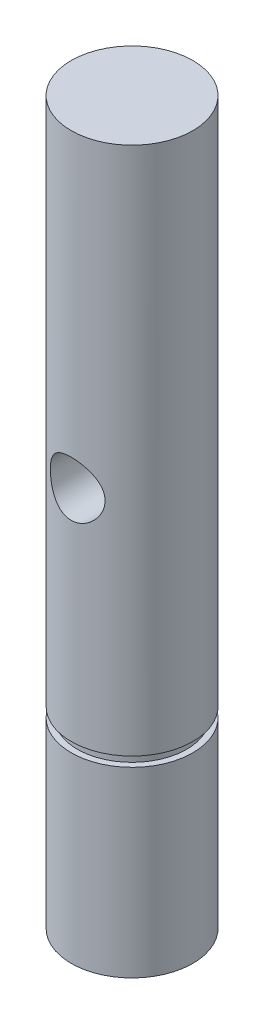
ISO-10303-21;
HEADER;
FILE_DESCRIPTION(('STEP AP214'),'2;1');
FILE_NAME('part.step','',(''),(''),'','','');
FILE_SCHEMA(('AUTOMOTIVE_DESIGN { 1 0 10303 214 1 1 1 1 }'));
ENDSEC;
DATA;
#1=APPLICATION_CONTEXT('core data for automotive mechanical design processes');
#2=APPLICATION_PROTOCOL_DEFINITION('international standard','automotive_design',2000,#1);
#3=PRODUCT_CONTEXT('',#1,'mechanical');
#4=PRODUCT('Part','Part','',(#3));
#5=PRODUCT_RELATED_PRODUCT_CATEGORY('part','',(#4));
#6=PRODUCT_DEFINITION_FORMATION('','',#4);
#7=PRODUCT_DEFINITION_CONTEXT('part definition',#1,'design');
#8=PRODUCT_DEFINITION('design','',#6,#7);
#9=PRODUCT_DEFINITION_SHAPE('','',#8);
#10=(LENGTH_UNIT() NAMED_UNIT(*) SI_UNIT(.MILLI.,.METRE.));
#11=(NAMED_UNIT(*) PLANE_ANGLE_UNIT() SI_UNIT($,.RADIAN.));
#12=(NAMED_UNIT(*) SI_UNIT($,.STERADIAN.) SOLID_ANGLE_UNIT());
#13=UNCERTAINTY_MEASURE_WITH_UNIT(LENGTH_MEASURE(1.E-05),#10,'distance_accuracy_value','');
#14=(GEOMETRIC_REPRESENTATION_CONTEXT(3) GLOBAL_UNCERTAINTY_ASSIGNED_CONTEXT((#13)) GLOBAL_UNIT_ASSIGNED_CONTEXT((#10,
#11,#12)) REPRESENTATION_CONTEXT('',''));
#15=CARTESIAN_POINT('',(0.,0.,0.));
#16=DIRECTION('',(0.,0.,1.));
#17=DIRECTION('',(1.,0.,0.));
#18=AXIS2_PLACEMENT_3D('',#15,#16,#17);
#19=CARTESIAN_POINT('',(0.,59.3,0.));
#20=DIRECTION('',(0.,-1.,0.));
#21=DIRECTION('',(0.,0.,-1.));
#22=AXIS2_PLACEMENT_3D('',#19,#20,#21);
#23=CYLINDRICAL_SURFACE('',#22,5.);
#24=CARTESIAN_POINT('',(0.,36.05,-5.));
#25=CARTESIAN_POINT('',(-0.119657163872057,36.0499941508325,-4.9999951803291));
#26=CARTESIAN_POINT('',(-0.2394972095774,36.040398554356,-4.99565681806759));
#27=CARTESIAN_POINT('',(-0.475720816707709,36.0024004970845,-4.97873356251569));
#28=CARTESIAN_POINT('',(-0.592095550925139,35.9739536941356,-4.96612922657762));
#29=CARTESIAN_POINT('',(-0.817598389702703,35.8995417374731,-4.93401032574636));
#30=CARTESIAN_POINT('',(-0.926750955125893,35.8536396901104,-4.91452067131296));
#31=CARTESIAN_POINT('',(-1.13568251878513,35.745906304151,-4.87048664392257));
#32=CARTESIAN_POINT('',(-1.23546350613327,35.6840783562912,-4.84594334714473));
#33=CARTESIAN_POINT('',(-1.42864166958965,35.5425702502373,-4.7926545488551));
#34=CARTESIAN_POINT('',(-1.52144083505235,35.4621315255467,-4.76375726911886));
#35=CARTESIAN_POINT('',(-1.69276142751265,35.2872976020405,-4.7056093324505));
#36=CARTESIAN_POINT('',(-1.77127412914542,35.1928939376057,-4.67635847112187));
#37=CARTESIAN_POINT('',(-1.91644184676257,34.9860212054054,-4.61884309478044));
#38=CARTESIAN_POINT('',(-1.98211224629651,34.8728110950827,-4.59074106078138));
#39=CARTESIAN_POINT('',(-2.09321326547296,34.6355185417193,-4.54116574662787));
#40=CARTESIAN_POINT('',(-2.13865597929339,34.5114426486112,-4.51968850785886));
#41=CARTESIAN_POINT('',(-2.2054422070107,34.262806781862,-4.48746493874362));
#42=CARTESIAN_POINT('',(-2.22794402601262,34.1386271752549,-4.47620638732559));
#43=CARTESIAN_POINT('',(-2.25180742161622,33.8877845994371,-4.46425372050826));
#44=CARTESIAN_POINT('',(-2.25318367120293,33.7611234150613,-4.46355227256902));
#45=CARTESIAN_POINT('',(-2.23561914182213,33.5214180581905,-4.4723671338535));
#46=CARTESIAN_POINT('',(-2.2185407575292,33.4081955432716,-4.48094689435861));
#47=CARTESIAN_POINT('',(-2.16771485945775,33.1864380235561,-4.5057522601785));
#48=CARTESIAN_POINT('',(-2.13396347414753,33.0779041138392,-4.52197964125845));
#49=CARTESIAN_POINT('',(-2.05008139659869,32.8656613346161,-4.56062840437285));
#50=CARTESIAN_POINT('',(-1.99959732959401,32.7621172350035,-4.58318164475399));
#51=CARTESIAN_POINT('',(-1.88393825005056,32.5645259052392,-4.63192287969266));
#52=CARTESIAN_POINT('',(-1.81875698614686,32.4704827409736,-4.65811241910162));
#53=CARTESIAN_POINT('',(-1.66791131474516,32.2846493257256,-4.71435794303027));
#54=CARTESIAN_POINT('',(-1.58084940988695,32.194027618604,-4.74453849261979));
#55=CARTESIAN_POINT('',(-1.39252160551636,32.0282416628495,-4.80318714257221));
#56=CARTESIAN_POINT('',(-1.2912512139917,31.9530823212481,-4.83165469728905));
#57=CARTESIAN_POINT('',(-1.07332333935315,31.8182362246468,-4.88476427737967));
#58=CARTESIAN_POINT('',(-0.956286364396326,31.7591009344205,-4.90926046885464));
#59=CARTESIAN_POINT('',(-0.712539817711667,31.6617820285451,-4.95050723789684));
#60=CARTESIAN_POINT('',(-0.585836558945032,31.6235848695963,-4.96726282117482));
#61=CARTESIAN_POINT('',(-0.336050927795551,31.5718479933816,-4.99015693100556));
#62=CARTESIAN_POINT('',(-0.213354125401072,31.5567448896773,-4.99696705652231));
#63=CARTESIAN_POINT('',(0.033002854959611,31.5468706262329,-5.00140648285731));
#64=CARTESIAN_POINT('',(0.156662679358164,31.5520923259077,-4.99903900798532));
#65=CARTESIAN_POINT('',(0.393606397102686,31.5816725282754,-4.98581223187087));
#66=CARTESIAN_POINT('',(0.507068143127033,31.6048661216162,-4.97547003197285));
#67=CARTESIAN_POINT('',(0.728326171242952,31.6680331296803,-4.94792660884623));
#68=CARTESIAN_POINT('',(0.836121769198286,31.708008565447,-4.93072455949595));
#69=CARTESIAN_POINT('',(1.0468032844483,31.8048645461602,-4.89040595603713));
#70=CARTESIAN_POINT('',(1.14943204917315,31.8622324242414,-4.86712201520423));
#71=CARTESIAN_POINT('',(1.34397554623912,31.9917138422134,-4.81703610915173));
#72=CARTESIAN_POINT('',(1.43588556437493,32.0638338321065,-4.79023260693119));
#73=CARTESIAN_POINT('',(1.61437331335905,32.227690333341,-4.73321088066406));
#74=CARTESIAN_POINT('',(1.69988735602747,32.3205536670442,-4.70289328565378));
#75=CARTESIAN_POINT('',(1.85448776672914,32.5196605639013,-4.64410716992065));
#76=CARTESIAN_POINT('',(1.92356783385003,32.6259092352926,-4.61563936145101));
#77=CARTESIAN_POINT('',(2.0448687723509,32.8524119938838,-4.56322301354684));
#78=CARTESIAN_POINT('',(2.09661295115779,32.9729549150335,-4.53940877273745));
#79=CARTESIAN_POINT('',(2.17856642952346,33.2224663797286,-4.50065987671192));
#80=CARTESIAN_POINT('',(2.20879749107799,33.3514262643155,-4.48571625080529));
#81=CARTESIAN_POINT('',(2.24454528993164,33.602147412113,-4.46792778615278));
#82=CARTESIAN_POINT('',(2.25196758692373,33.7235711103763,-4.46415115998432));
#83=CARTESIAN_POINT('',(2.24714266058781,33.9659106486577,-4.46658268326981));
#84=CARTESIAN_POINT('',(2.23489992569103,34.0868265982512,-4.47278855427626));
#85=CARTESIAN_POINT('',(2.19277345398221,34.3167678221568,-4.49357716344733));
#86=CARTESIAN_POINT('',(2.1640532846186,34.4260616630034,-4.50760581250428));
#87=CARTESIAN_POINT('',(2.09103437001124,34.6382569690474,-4.54193721731516));
#88=CARTESIAN_POINT('',(2.04673109152544,34.7411565638507,-4.56224179857571));
#89=CARTESIAN_POINT('',(1.94052895513635,34.9449425819386,-4.60845986490249));
#90=CARTESIAN_POINT('',(1.87767694712305,35.045267781668,-4.63465129287797));
#91=CARTESIAN_POINT('',(1.7373806274927,35.2345379466943,-4.68904747578369));
#92=CARTESIAN_POINT('',(1.65993003008871,35.3234779820221,-4.71725309471255));
#93=CARTESIAN_POINT('',(1.48434630972137,35.4957826227624,-4.77556462695219));
#94=CARTESIAN_POINT('',(1.3849750965528,35.5779120561799,-4.8056111870999));
#95=CARTESIAN_POINT('',(1.17282336441816,35.7244746098651,-4.8617393821882));
#96=CARTESIAN_POINT('',(1.06003671208436,35.7888995909801,-4.88781919106815));
#97=CARTESIAN_POINT('',(0.825071548433898,35.8972194043047,-4.93289199970098));
#98=CARTESIAN_POINT('',(0.702997935707187,35.9413126019502,-4.95195309116145));
#99=CARTESIAN_POINT('',(0.452281842298332,36.0078630803421,-4.9810892043169));
#100=CARTESIAN_POINT('',(0.323660544978677,36.0303859776352,-4.9911914716417));
#101=CARTESIAN_POINT('',(0.161835421205047,36.044407857878,-4.99748612119021));
#102=CARTESIAN_POINT('',(0.129515019999642,36.0465028809597,-4.99842714593435));
#103=CARTESIAN_POINT('',(0.0648008846979576,36.0492997536287,-4.99968474227602));
#104=CARTESIAN_POINT('',(0.0324071496041521,36.0500015841496,-5.00000130532758));
#105=CARTESIAN_POINT('',(0.,36.05,-5.));
#106=B_SPLINE_CURVE_WITH_KNOTS('',3,(#24,#25,#26,#27,#28,#29,#30,#31,#32,#33,#34,#35,#36,#37,
#38,#39,#40,#41,#42,#43,#44,#45,#46,#47,#48,#49,#50,#51,#52,#53,#54,#55,#56,#57,#58,#59,#60,#61,
#62,#63,#64,#65,#66,#67,#68,#69,#70,#71,#72,#73,#74,#75,#76,#77,#78,#79,#80,#81,#82,#83,#84,#85,
#86,#87,#88,#89,#90,#91,#92,#93,#94,#95,#96,#97,#98,#99,#100,#101,#102,#103,#104,#105),
.UNSPECIFIED.,.T.,.F.,(4,2,2,2,2,2,2,2,2,2,2,2,2,2,2,2,2,2,2,2,2,2,2,2,2,2,2,2,2,2,2,2,2,2,2,2,
2,2,2,2,4),(0.,0.358838474045362,0.718524024886281,1.07692137234716,1.43524247745089,
1.81211589040082,2.18921870938886,2.58877923399089,2.98810053852175,3.36607753259061,
3.74379198689987,4.08666490416552,4.42961747522457,4.78033096378956,5.13119390858612,
5.51719011281458,5.90330862586184,6.30138888099423,6.69921134324785,7.06867955514896,
7.43801797582675,7.78523528011159,8.13249441190392,8.49055929702834,8.84878107324681,
9.23652488450211,9.62441712097651,10.0222360675986,10.4196520187761,10.782814484147,
11.1458940715369,11.486031651511,11.8262682619787,12.1885231613985,12.5509343964944,
12.9461798591982,13.3416067227122,13.7330894595624,14.1233774929091,14.2205615861382,
14.3177470093574),.UNSPECIFIED.);
#107=CARTESIAN_POINT('',(0.,36.05,-5.));
#108=VERTEX_POINT('',#107);
#109=EDGE_CURVE('E10',#108,#108,#106,.T.);
#110=ORIENTED_EDGE('',*,*,#109,.T.);
#111=EDGE_LOOP('',(#110));
#112=FACE_BOUND('',#111,.T.);
#113=CARTESIAN_POINT('',(2.25,33.8,4.46514277487294));
#114=CARTESIAN_POINT('',(2.24999304031583,33.6810387872691,4.46515039872742));
#115=CARTESIAN_POINT('',(2.24050444334663,33.5618852197389,4.4699666726898));
#116=CARTESIAN_POINT('',(2.20296952025721,33.3271018284973,4.48857891323592));
#117=CARTESIAN_POINT('',(2.17487687588999,33.2114815551227,4.50239729083484));
#118=CARTESIAN_POINT('',(2.10149811494296,32.9875840285442,4.53710585458752));
#119=CARTESIAN_POINT('',(2.05629003690716,32.879276037285,4.55796389692775));
#120=CARTESIAN_POINT('',(1.95019826041788,32.671809245018,4.6043530345761));
#121=CARTESIAN_POINT('',(1.88931647308661,32.5726493305704,4.62988356005072));
#122=CARTESIAN_POINT('',(1.74886682448111,32.3790152310073,4.6848168738739));
#123=CARTESIAN_POINT('',(1.66832919766814,32.2852850632113,4.71436409953233));
#124=CARTESIAN_POINT('',(1.49288314705885,32.1121009236461,4.77282391954203));
#125=CARTESIAN_POINT('',(1.39796864967689,32.0326530166617,4.80173623973545));
#126=CARTESIAN_POINT('',(1.19040340238111,31.8862642005538,4.85747480215182));
#127=CARTESIAN_POINT('',(1.0770863493284,31.8201902456851,4.88411395697375));
#128=CARTESIAN_POINT('',(0.839526009772626,31.7083730190249,4.93049745168418));
#129=CARTESIAN_POINT('',(0.715288381409386,31.6626192924835,4.95024533600557));
#130=CARTESIAN_POINT('',(0.46725363211648,31.5955312718054,4.97959116820759));
#131=CARTESIAN_POINT('',(0.343870281116729,31.5729058054981,4.98972320525301));
#132=CARTESIAN_POINT('',(0.0946715176300397,31.5485139386555,5.00065622282591));
#133=CARTESIAN_POINT('',(-0.0311427027271387,31.5467375611082,5.00146166644926));
#134=CARTESIAN_POINT('',(-0.272124930597737,31.5634846149598,4.99394241822247));
#135=CARTESIAN_POINT('',(-0.387416232492517,31.5805802947329,4.98625984599743));
#136=CARTESIAN_POINT('',(-0.613288459239054,31.6320981851849,4.96354367577184));
#137=CARTESIAN_POINT('',(-0.72386903433814,31.6665216799616,4.94850953297701));
#138=CARTESIAN_POINT('',(-0.939228995401038,31.7520780505759,4.91222614034771));
#139=CARTESIAN_POINT('',(-1.04389475376015,31.8034567865346,4.89088595660149));
#140=CARTESIAN_POINT('',(-1.24339321925695,31.9211962951282,4.84401587857545));
#141=CARTESIAN_POINT('',(-1.3382223125092,31.9875625457658,4.81848445331244));
#142=CARTESIAN_POINT('',(-1.52345175293302,32.1395558357204,4.76331481407976));
#143=CARTESIAN_POINT('',(-1.61288673432273,32.22630082335,4.73351145466938));
#144=CARTESIAN_POINT('',(-1.77639992608746,32.4135073005329,4.67460929075157));
#145=CARTESIAN_POINT('',(-1.85047011655517,32.5139759082102,4.6455108611573));
#146=CARTESIAN_POINT('',(-1.9842398101775,32.7312356755283,4.59001891824128));
#147=CARTESIAN_POINT('',(-2.04317215242966,32.848547437004,4.56379860249299));
#148=CARTESIAN_POINT('',(-2.14003834281189,33.0929140470942,4.51919374197597));
#149=CARTESIAN_POINT('',(-2.17799005773757,33.219960500469,4.50080253313332));
#150=CARTESIAN_POINT('',(-2.22914248632389,33.4704937388217,4.47567706017381));
#151=CARTESIAN_POINT('',(-2.24392437246759,33.5935813806313,4.46820077828806));
#152=CARTESIAN_POINT('',(-2.25302242470034,33.8406793100698,4.46362263539942));
#153=CARTESIAN_POINT('',(-2.2473478942298,33.964689152686,4.46651605832117));
#154=CARTESIAN_POINT('',(-2.21714216163569,34.1996001648763,4.48157509018498));
#155=CARTESIAN_POINT('',(-2.19415743855621,34.3107558097788,4.49297960430386));
#156=CARTESIAN_POINT('',(-2.13212542419366,34.5274996545956,4.52274424903303));
#157=CARTESIAN_POINT('',(-2.09307393216707,34.6330863903371,4.54110619860308));
#158=CARTESIAN_POINT('',(-1.99809284583429,34.8410481707792,4.58371481317643));
#159=CARTESIAN_POINT('',(-1.94148122987605,34.9430633649458,4.60818960972127));
#160=CARTESIAN_POINT('',(-1.81362927889096,35.1366836138208,4.65998955680978));
#161=CARTESIAN_POINT('',(-1.74238196666509,35.2282836708995,4.68731606376624));
#162=CARTESIAN_POINT('',(-1.57908877421523,35.4078255379359,4.74496334454854));
#163=CARTESIAN_POINT('',(-1.48568977503588,35.494531895157,4.77531541652934));
#164=CARTESIAN_POINT('',(-1.28502997436724,35.651326543911,4.8331762481073));
#165=CARTESIAN_POINT('',(-1.17776699723161,35.7214122222902,4.86068456021687));
#166=CARTESIAN_POINT('',(-0.950682209086046,35.8433961414959,4.91017542897077));
#167=CARTESIAN_POINT('',(-0.830745952505896,35.8951062823748,4.93210022008002));
#168=CARTESIAN_POINT('',(-0.582619539391231,35.9771762488785,4.96751583574373));
#169=CARTESIAN_POINT('',(-0.454435271872219,36.0075511270571,4.98101260572729));
#170=CARTESIAN_POINT('',(-0.204394813787128,36.0439710415703,4.99726613498169));
#171=CARTESIAN_POINT('',(-0.0828396086643649,36.0517498349332,5.00078768109045));
#172=CARTESIAN_POINT('',(0.159848279708579,36.0475911911414,4.99891579804308));
#173=CARTESIAN_POINT('',(0.280981054375446,36.0356583241909,4.99352443536979));
#174=CARTESIAN_POINT('',(0.513549488452862,35.9936476316651,4.97486307031119));
#175=CARTESIAN_POINT('',(0.625174452755542,35.9644355034439,4.96196940870592));
#176=CARTESIAN_POINT('',(0.841845251095437,35.889721662337,4.92983796875448));
#177=CARTESIAN_POINT('',(0.94688994814451,35.8442171434013,4.9105990976134));
#178=CARTESIAN_POINT('',(1.1527517065352,35.7359251090506,4.86649288960106));
#179=CARTESIAN_POINT('',(1.25315478757822,35.6724414763288,4.84140812281739));
#180=CARTESIAN_POINT('',(1.4423245633934,35.5309445814171,4.78846161065104));
#181=CARTESIAN_POINT('',(1.53108621316286,35.4529250550821,4.76059867044869));
#182=CARTESIAN_POINT('',(1.70196716671107,35.2771636475261,4.70235094807989));
#183=CARTESIAN_POINT('',(1.78296764783156,35.1783366721409,4.67194455656386));
#184=CARTESIAN_POINT('',(1.92749297632141,34.9677352006364,4.61420006725822));
#185=CARTESIAN_POINT('',(1.99100658915978,34.8559524462233,4.58686394862663));
#186=CARTESIAN_POINT('',(2.09879543180337,34.6211515361848,4.53856864513167));
#187=CARTESIAN_POINT('',(2.14295192965231,34.49806949051,4.51764904631087));
#188=CARTESIAN_POINT('',(2.19275164773714,34.3085450162447,4.49356898894665));
#189=CARTESIAN_POINT('',(2.20660710269014,34.2446151097391,4.48676181351279));
#190=CARTESIAN_POINT('',(2.22871677888321,34.1155836028458,4.47582163437334));
#191=CARTESIAN_POINT('',(2.2369751798922,34.0504829141542,4.47168663524699));
#192=CARTESIAN_POINT('',(2.2449126944791,33.9543423353983,4.46770340658946));
#193=CARTESIAN_POINT('',(2.24681915664303,33.9235140886301,4.46674464896162));
#194=CARTESIAN_POINT('',(2.24936373361878,33.8617948896694,4.46546333269431));
#195=CARTESIAN_POINT('',(2.25000180799797,33.8309039355094,4.46514079433574));
#196=CARTESIAN_POINT('',(2.25,33.8,4.46514277487294));
#197=B_SPLINE_CURVE_WITH_KNOTS('',3,(#113,#114,#115,#116,#117,#118,#119,#120,#121,#122,#123,
#124,#125,#126,#127,#128,#129,#130,#131,#132,#133,#134,#135,#136,#137,#138,#139,#140,#141,#142,
#143,#144,#145,#146,#147,#148,#149,#150,#151,#152,#153,#154,#155,#156,#157,#158,#159,#160,#161,
#162,#163,#164,#165,#166,#167,#168,#169,#170,#171,#172,#173,#174,#175,#176,#177,#178,#179,#180,
#181,#182,#183,#184,#185,#186,#187,#188,#189,#190,#191,#192,#193,#194,#195,#196),.UNSPECIFIED.,
.T.,.F.,(4,2,2,2,2,2,2,2,2,2,2,2,2,2,2,2,2,2,2,2,2,2,2,2,2,2,2,2,2,2,2,2,2,2,2,2,2,2,2,2,2,4),
(0.,0.356759742987548,0.714411062073144,1.07045091984823,1.42644738561851,1.80599601944598,
2.18570544513355,2.58519198578236,2.98447275197117,3.35999219707463,3.73533193577184,
4.08410830185014,4.43291051821014,4.78701075889258,5.14124063485553,5.52388400014614,
5.90672659268635,6.30625734447515,6.70544733553703,7.0759816733518,7.44634751591088,
7.78705357899947,8.12784877819471,8.48402022975504,8.84036187276861,9.23157909435329,
9.62285778358306,10.0180336177098,10.412930364732,10.7766046049827,11.1401945381678,
11.4869501554105,11.83376552337,12.1964652511595,12.5593216450042,12.9515422543471,
13.3440142630044,13.7388610212111,13.9359176589375,14.1328269760451,14.2255036426529,
14.318183263485),.UNSPECIFIED.);
#198=CARTESIAN_POINT('',(2.25,33.8,4.46514277487294));
#199=VERTEX_POINT('',#198);
#200=EDGE_CURVE('E48',#199,#199,#197,.T.);
#201=ORIENTED_EDGE('',*,*,#200,.T.);
#202=EDGE_LOOP('',(#201));
#203=FACE_BOUND('',#202,.T.);
#204=CARTESIAN_POINT('',(0.,59.3,0.));
#205=DIRECTION('',(0.,1.,0.));
#206=DIRECTION('',(0.,0.,1.));
#207=AXIS2_PLACEMENT_3D('',#204,#205,#206);
#208=CIRCLE('',#207,5.);
#209=CARTESIAN_POINT('',(0.,59.3,5.));
#210=VERTEX_POINT('',#209);
#211=EDGE_CURVE('E52',#210,#210,#208,.T.);
#212=ORIENTED_EDGE('',*,*,#211,.F.);
#213=EDGE_LOOP('',(#212));
#214=FACE_BOUND('',#213,.T.);
#215=CARTESIAN_POINT('',(0.,15.8,0.));
#216=DIRECTION('',(0.,-1.,0.));
#217=DIRECTION('',(0.,0.,-1.));
#218=AXIS2_PLACEMENT_3D('',#215,#216,#217);
#219=CIRCLE('',#218,5.);
#220=CARTESIAN_POINT('',(0.,15.8,-5.));
#221=VERTEX_POINT('',#220);
#222=EDGE_CURVE('E99',#221,#221,#219,.T.);
#223=ORIENTED_EDGE('',*,*,#222,.F.);
#224=EDGE_LOOP('',(#223));
#225=FACE_BOUND('',#224,.T.);
#226=ADVANCED_FACE('F36',(#112,#203,#214,#225),#23,.T.);
#227=CARTESIAN_POINT('',(0.,59.3,0.));
#228=DIRECTION('',(0.,1.,0.));
#229=DIRECTION('',(0.,0.,1.));
#230=AXIS2_PLACEMENT_3D('',#227,#228,#229);
#231=PLANE('',#230);
#232=ORIENTED_EDGE('',*,*,#211,.T.);
#233=EDGE_LOOP('',(#232));
#234=FACE_BOUND('',#233,.T.);
#235=ADVANCED_FACE('F80',(#234),#231,.T.);
#236=CARTESIAN_POINT('',(0.,15.8,0.));
#237=DIRECTION('',(0.,-1.,0.));
#238=DIRECTION('',(0.,0.,-1.));
#239=AXIS2_PLACEMENT_3D('',#236,#237,#238);
#240=CYLINDRICAL_SURFACE('',#239,4.5);
#241=CARTESIAN_POINT('',(0.,15.8,0.));
#242=DIRECTION('',(0.,-1.,0.));
#243=DIRECTION('',(0.,0.,-1.));
#244=AXIS2_PLACEMENT_3D('',#241,#242,#243);
#245=CIRCLE('',#244,4.5);
#246=CARTESIAN_POINT('',(0.,15.8,-4.5));
#247=VERTEX_POINT('',#246);
#248=EDGE_CURVE('E101',#247,#247,#245,.T.);
#249=ORIENTED_EDGE('',*,*,#248,.T.);
#250=EDGE_LOOP('',(#249));
#251=FACE_BOUND('',#250,.T.);
#252=CARTESIAN_POINT('',(0.,15.,0.));
#253=DIRECTION('',(0.,-1.,0.));
#254=DIRECTION('',(0.,0.,-1.));
#255=AXIS2_PLACEMENT_3D('',#252,#253,#254);
#256=CIRCLE('',#255,4.5);
#257=CARTESIAN_POINT('',(0.,15.,-4.5));
#258=VERTEX_POINT('',#257);
#259=EDGE_CURVE('E108',#258,#258,#256,.T.);
#260=ORIENTED_EDGE('',*,*,#259,.F.);
#261=EDGE_LOOP('',(#260));
#262=FACE_BOUND('',#261,.T.);
#263=ADVANCED_FACE('F72',(#251,#262),#240,.T.);
#264=CARTESIAN_POINT('',(0.,15.8,0.));
#265=DIRECTION('',(0.,-1.,0.));
#266=DIRECTION('',(0.,0.,-1.));
#267=AXIS2_PLACEMENT_3D('',#264,#265,#266);
#268=PLANE('',#267);
#269=ORIENTED_EDGE('',*,*,#248,.F.);
#270=EDGE_LOOP('',(#269));
#271=FACE_BOUND('',#270,.T.);
#272=ORIENTED_EDGE('',*,*,#222,.T.);
#273=EDGE_LOOP('',(#272));
#274=FACE_BOUND('',#273,.T.);
#275=ADVANCED_FACE('F67',(#271,#274),#268,.T.);
#276=CARTESIAN_POINT('',(0.,15.,0.));
#277=DIRECTION('',(0.,-1.,0.));
#278=DIRECTION('',(0.,0.,-1.));
#279=AXIS2_PLACEMENT_3D('',#276,#277,#278);
#280=PLANE('',#279);
#281=ORIENTED_EDGE('',*,*,#259,.T.);
#282=EDGE_LOOP('',(#281));
#283=FACE_BOUND('',#282,.T.);
#284=CARTESIAN_POINT('',(0.,15.,0.));
#285=DIRECTION('',(0.,-1.,0.));
#286=DIRECTION('',(0.,0.,-1.));
#287=AXIS2_PLACEMENT_3D('',#284,#285,#286);
#288=CIRCLE('',#287,5.);
#289=CARTESIAN_POINT('',(0.,15.,-5.));
#290=VERTEX_POINT('',#289);
#291=EDGE_CURVE('E105',#290,#290,#288,.T.);
#292=ORIENTED_EDGE('',*,*,#291,.F.);
#293=EDGE_LOOP('',(#292));
#294=FACE_BOUND('',#293,.T.);
#295=ADVANCED_FACE('F71',(#283,#294),#280,.F.);
#296=CARTESIAN_POINT('',(0.,0.,0.));
#297=DIRECTION('',(0.,1.,0.));
#298=DIRECTION('',(0.,0.,1.));
#299=AXIS2_PLACEMENT_3D('',#296,#297,#298);
#300=PLANE('',#299);
#301=CARTESIAN_POINT('',(0.,0.,0.));
#302=DIRECTION('',(0.,1.,0.));
#303=DIRECTION('',(0.,0.,1.));
#304=AXIS2_PLACEMENT_3D('',#301,#302,#303);
#305=CIRCLE('',#304,5.);
#306=CARTESIAN_POINT('',(0.,0.,-5.));
#307=VERTEX_POINT('',#306);
#308=EDGE_CURVE('E56',#307,#307,#305,.T.);
#309=ORIENTED_EDGE('',*,*,#308,.F.);
#310=EDGE_LOOP('',(#309));
#311=FACE_BOUND('',#310,.T.);
#312=ADVANCED_FACE('F76',(#311),#300,.F.);
#313=CARTESIAN_POINT('',(0.,15.,-5.));
#314=CARTESIAN_POINT('',(0.,14.84375,-5.));
#315=CARTESIAN_POINT('',(0.,14.6875,-5.));
#316=CARTESIAN_POINT('',(0.,14.375,-5.));
#317=CARTESIAN_POINT('',(0.,14.21875,-5.));
#318=CARTESIAN_POINT('',(0.,13.90625,-5.));
#319=CARTESIAN_POINT('',(0.,13.75,-5.));
#320=CARTESIAN_POINT('',(0.,13.4375,-5.));
#321=CARTESIAN_POINT('',(0.,13.28125,-5.));
#322=CARTESIAN_POINT('',(0.,12.96875,-5.));
#323=CARTESIAN_POINT('',(0.,12.8125,-5.));
#324=CARTESIAN_POINT('',(0.,12.5,-5.));
#325=CARTESIAN_POINT('',(0.,12.34375,-5.));
#326=CARTESIAN_POINT('',(0.,12.03125,-5.));
#327=CARTESIAN_POINT('',(0.,11.875,-5.));
#328=CARTESIAN_POINT('',(0.,11.5625,-5.));
#329=CARTESIAN_POINT('',(0.,11.40625,-5.));
#330=CARTESIAN_POINT('',(0.,11.09375,-5.));
#331=CARTESIAN_POINT('',(0.,10.9375,-5.));
#332=CARTESIAN_POINT('',(0.,10.625,-5.));
#333=CARTESIAN_POINT('',(0.,10.46875,-5.));
#334=CARTESIAN_POINT('',(0.,10.15625,-5.));
#335=CARTESIAN_POINT('',(0.,10.,-5.));
#336=CARTESIAN_POINT('',(0.,9.6875,-5.));
#337=CARTESIAN_POINT('',(0.,9.53125,-5.));
#338=CARTESIAN_POINT('',(0.,9.21875,-5.));
#339=CARTESIAN_POINT('',(0.,9.0625,-5.));
#340=CARTESIAN_POINT('',(0.,8.75,-5.));
#341=CARTESIAN_POINT('',(0.,8.59375,-5.));
#342=CARTESIAN_POINT('',(0.,8.28125,-5.));
#343=CARTESIAN_POINT('',(0.,8.125,-5.));
#344=CARTESIAN_POINT('',(0.,7.8125,-5.));
#345=CARTESIAN_POINT('',(0.,7.65625,-5.));
#346=CARTESIAN_POINT('',(0.,7.34375,-5.));
#347=CARTESIAN_POINT('',(0.,7.1875,-5.));
#348=CARTESIAN_POINT('',(0.,6.875,-5.));
#349=CARTESIAN_POINT('',(0.,6.71875,-5.));
#350=CARTESIAN_POINT('',(0.,6.40625,-5.));
#351=CARTESIAN_POINT('',(0.,6.25,-5.));
#352=CARTESIAN_POINT('',(0.,5.9375,-5.));
#353=CARTESIAN_POINT('',(0.,5.78125,-5.));
#354=CARTESIAN_POINT('',(0.,5.46875,-5.));
#355=CARTESIAN_POINT('',(0.,5.3125,-5.));
#356=CARTESIAN_POINT('',(0.,5.,-5.));
#357=CARTESIAN_POINT('',(0.,4.84375,-5.));
#358=CARTESIAN_POINT('',(0.,4.53125,-5.));
#359=CARTESIAN_POINT('',(0.,4.375,-5.));
#360=CARTESIAN_POINT('',(0.,4.0625,-5.));
#361=CARTESIAN_POINT('',(0.,3.90625,-5.));
#362=CARTESIAN_POINT('',(0.,3.59375,-5.));
#363=CARTESIAN_POINT('',(0.,3.4375,-5.));
#364=CARTESIAN_POINT('',(0.,3.125,-5.));
#365=CARTESIAN_POINT('',(0.,2.96875,-5.));
#366=CARTESIAN_POINT('',(0.,2.65625,-5.));
#367=CARTESIAN_POINT('',(0.,2.5,-5.));
#368=CARTESIAN_POINT('',(0.,2.1875,-5.));
#369=CARTESIAN_POINT('',(0.,2.03125,-5.));
#370=CARTESIAN_POINT('',(0.,1.71875,-5.));
#371=CARTESIAN_POINT('',(0.,1.5625,-5.));
#372=CARTESIAN_POINT('',(0.,1.25,-5.));
#373=CARTESIAN_POINT('',(0.,1.09375,-5.));
#374=CARTESIAN_POINT('',(0.,0.781250000000002,-5.));
#375=CARTESIAN_POINT('',(0.,0.625000000000003,-5.));
#376=CARTESIAN_POINT('',(0.,0.312500000000003,-5.));
#377=CARTESIAN_POINT('',(0.,0.156250000000002,-5.));
#378=CARTESIAN_POINT('',(0.,0.,-5.));
#379=B_SPLINE_CURVE_WITH_KNOTS('',3,(#313,#314,#315,#316,#317,#318,#319,#320,#321,#322,#323,
#324,#325,#326,#327,#328,#329,#330,#331,#332,#333,#334,#335,#336,#337,#338,#339,#340,#341,#342,
#343,#344,#345,#346,#347,#348,#349,#350,#351,#352,#353,#354,#355,#356,#357,#358,#359,#360,#361,
#362,#363,#364,#365,#366,#367,#368,#369,#370,#371,#372,#373,#374,#375,#376,#377,#378),
.UNSPECIFIED.,.F.,.F.,(4,2,2,2,2,2,2,2,2,2,2,2,2,2,2,2,2,2,2,2,2,2,2,2,2,2,2,2,2,2,2,2,4),(0.,
0.468749999999997,0.937500000000001,1.40625,1.875,2.34375,2.8125,3.28125,3.75,4.21875,4.6875,
5.15625,5.625,6.09375,6.5625,7.03125,7.5,7.96875,8.4375,8.90625,9.375,9.84375,10.3125,10.78125,
11.25,11.71875,12.1875,12.65625,13.125,13.59375,14.0625,14.53125,15.),.UNSPECIFIED.);
#380=EDGE_CURVE('BSEAM38',#290,#307,#379,.T.);
#381=ORIENTED_EDGE('',*,*,#291,.T.);
#382=ORIENTED_EDGE('',*,*,#308,.T.);
#383=ORIENTED_EDGE('',*,*,#380,.T.);
#384=ORIENTED_EDGE('',*,*,#380,.F.);
#385=EDGE_LOOP('',(#381,#383,#382,#384));
#386=FACE_BOUND('',#385,.T.);
#387=ADVANCED_FACE('F38',(#386),#23,.T.);
#388=CARTESIAN_POINT('',(0.,33.8,5.));
#389=DIRECTION('',(0.,0.,1.));
#390=DIRECTION('',(1.,0.,0.));
#391=AXIS2_PLACEMENT_3D('',#388,#389,#390);
#392=CYLINDRICAL_SURFACE('',#391,2.25);
#393=ORIENTED_EDGE('',*,*,#200,.F.);
#394=EDGE_LOOP('',(#393));
#395=FACE_BOUND('',#394,.T.);
#396=ORIENTED_EDGE('',*,*,#109,.F.);
#397=EDGE_LOOP('',(#396));
#398=FACE_BOUND('',#397,.T.);
#399=ADVANCED_FACE('F62',(#395,#398),#392,.F.);
#400=CLOSED_SHELL('',(#226,#235,#263,#275,#295,#312,#387,#399));
#401=MANIFOLD_SOLID_BREP('B2',#400);
#402=ADVANCED_BREP_SHAPE_REPRESENTATION('',(#18,#401),#14);
#403=SHAPE_DEFINITION_REPRESENTATION(#9,#402);
ENDSEC;
END-ISO-10303-21;
